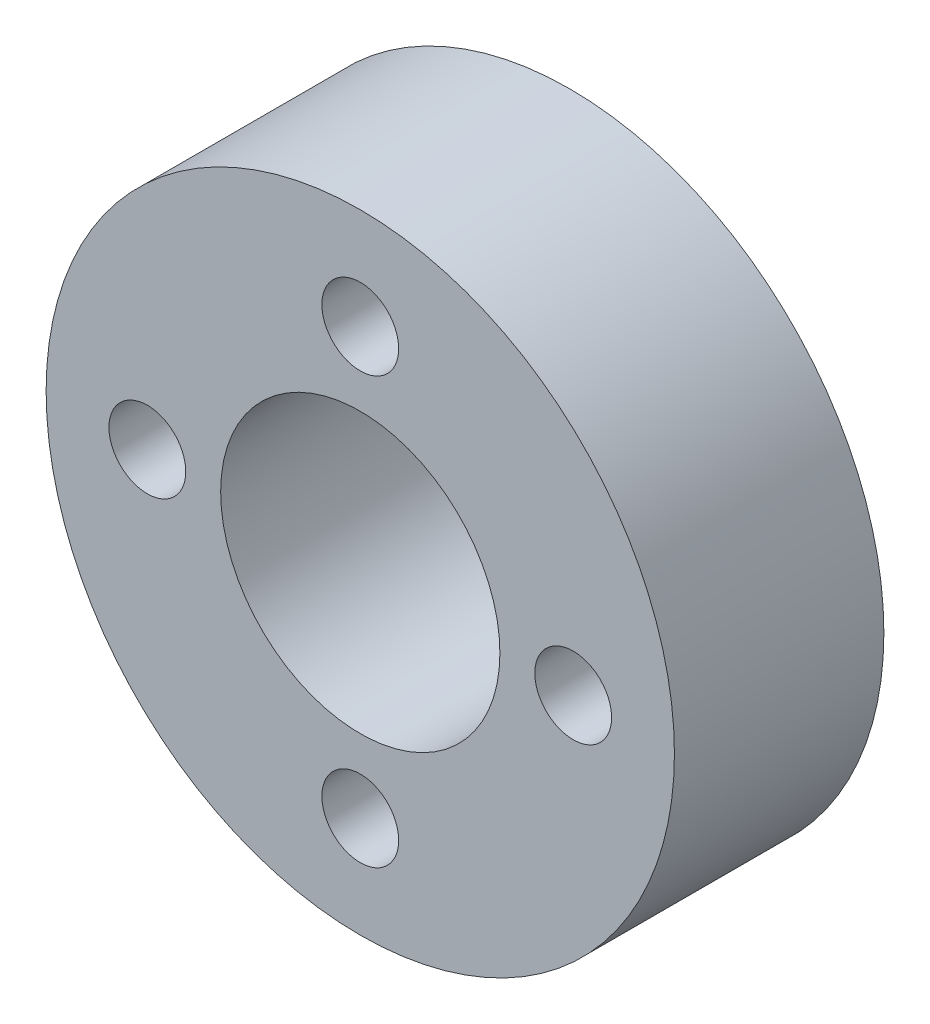
ISO-10303-21;
HEADER;
FILE_DESCRIPTION(('STEP AP214'),'2;1');
FILE_NAME('part.step','',(''),(''),'','','');
FILE_SCHEMA(('AUTOMOTIVE_DESIGN { 1 0 10303 214 1 1 1 1 }'));
ENDSEC;
DATA;
#1=APPLICATION_CONTEXT('core data for automotive mechanical design processes');
#2=APPLICATION_PROTOCOL_DEFINITION('international standard','automotive_design',2000,#1);
#3=PRODUCT_CONTEXT('',#1,'mechanical');
#4=PRODUCT('Part','Part','',(#3));
#5=PRODUCT_RELATED_PRODUCT_CATEGORY('part','',(#4));
#6=PRODUCT_DEFINITION_FORMATION('','',#4);
#7=PRODUCT_DEFINITION_CONTEXT('part definition',#1,'design');
#8=PRODUCT_DEFINITION('design','',#6,#7);
#9=PRODUCT_DEFINITION_SHAPE('','',#8);
#10=(LENGTH_UNIT() NAMED_UNIT(*) SI_UNIT(.MILLI.,.METRE.));
#11=(NAMED_UNIT(*) PLANE_ANGLE_UNIT() SI_UNIT($,.RADIAN.));
#12=(NAMED_UNIT(*) SI_UNIT($,.STERADIAN.) SOLID_ANGLE_UNIT());
#13=UNCERTAINTY_MEASURE_WITH_UNIT(LENGTH_MEASURE(1.E-05),#10,'distance_accuracy_value','');
#14=(GEOMETRIC_REPRESENTATION_CONTEXT(3) GLOBAL_UNCERTAINTY_ASSIGNED_CONTEXT((#13)) GLOBAL_UNIT_ASSIGNED_CONTEXT((#10,
#11,#12)) REPRESENTATION_CONTEXT('',''));
#15=CARTESIAN_POINT('',(0.,0.,0.));
#16=DIRECTION('',(0.,0.,1.));
#17=DIRECTION('',(1.,0.,0.));
#18=AXIS2_PLACEMENT_3D('',#15,#16,#17);
#19=CARTESIAN_POINT('',(0.,0.,-2.));
#20=DIRECTION('',(0.,0.,1.));
#21=DIRECTION('',(1.,0.,0.));
#22=AXIS2_PLACEMENT_3D('',#19,#20,#21);
#23=CYLINDRICAL_SURFACE('',#22,16.);
#24=CARTESIAN_POINT('',(0.,0.,0.));
#25=DIRECTION('',(0.,0.,-1.));
#26=DIRECTION('',(-1.,0.,0.));
#27=AXIS2_PLACEMENT_3D('',#24,#25,#26);
#28=CIRCLE('',#27,16.);
#29=CARTESIAN_POINT('',(-15.7704918032787,2.70029411041083,0.));
#30=VERTEX_POINT('',#29);
#31=CARTESIAN_POINT('',(-2.70029411041087,15.7704918032787,0.));
#32=VERTEX_POINT('',#31);
#33=EDGE_CURVE('E117',#30,#32,#28,.T.);
#34=ORIENTED_EDGE('',*,*,#33,.T.);
#35=DIRECTION('',(0.,0.,-1.));
#36=VECTOR('',#35,1.);
#37=CARTESIAN_POINT('',(-2.70029411041088,15.7704918032787,6.5));
#38=LINE('',#37,#36);
#39=CARTESIAN_POINT('',(-2.70029411041088,15.7704918032787,-2.));
#40=VERTEX_POINT('',#39);
#41=EDGE_CURVE('E180',#32,#40,#38,.T.);
#42=ORIENTED_EDGE('',*,*,#41,.T.);
#43=CARTESIAN_POINT('',(0.,0.,-2.));
#44=DIRECTION('',(0.,0.,-1.));
#45=DIRECTION('',(-1.,0.,0.));
#46=AXIS2_PLACEMENT_3D('',#43,#44,#45);
#47=CIRCLE('',#46,16.);
#48=CARTESIAN_POINT('',(-15.7704918032787,2.70029411041083,-2.));
#49=VERTEX_POINT('',#48);
#50=EDGE_CURVE('E140',#49,#40,#47,.T.);
#51=ORIENTED_EDGE('',*,*,#50,.F.);
#52=DIRECTION('',(0.,0.,-1.));
#53=VECTOR('',#52,1.);
#54=CARTESIAN_POINT('',(-15.7704918032787,2.70029411041083,6.5));
#55=LINE('',#54,#53);
#56=EDGE_CURVE('E127',#49,#30,#55,.F.);
#57=ORIENTED_EDGE('',*,*,#56,.T.);
#58=EDGE_LOOP('',(#34,#42,#51,#57));
#59=FACE_BOUND('',#58,.T.);
#60=ADVANCED_FACE('F45',(#59),#23,.T.);
#61=CARTESIAN_POINT('',(2.70029411041087,15.7704918032787,-2.));
#62=VERTEX_POINT('',#61);
#63=CARTESIAN_POINT('',(15.7704918032787,2.70029411041105,-2.));
#64=VERTEX_POINT('',#63);
#65=EDGE_CURVE('E135',#62,#64,#47,.T.);
#66=ORIENTED_EDGE('',*,*,#65,.F.);
#67=DIRECTION('',(0.,0.,-1.));
#68=VECTOR('',#67,1.);
#69=CARTESIAN_POINT('',(2.70029411041088,15.7704918032787,6.5));
#70=LINE('',#69,#68);
#71=CARTESIAN_POINT('',(2.70029411041088,15.7704918032787,0.));
#72=VERTEX_POINT('',#71);
#73=EDGE_CURVE('E172',#62,#72,#70,.F.);
#74=ORIENTED_EDGE('',*,*,#73,.T.);
#75=CARTESIAN_POINT('',(15.7704918032787,2.70029411041103,0.));
#76=VERTEX_POINT('',#75);
#77=EDGE_CURVE('E152',#72,#76,#28,.T.);
#78=ORIENTED_EDGE('',*,*,#77,.T.);
#79=DIRECTION('',(0.,0.,-1.));
#80=VECTOR('',#79,1.);
#81=CARTESIAN_POINT('',(15.7704918032787,2.70029411041105,6.5));
#82=LINE('',#81,#80);
#83=EDGE_CURVE('E163',#76,#64,#82,.T.);
#84=ORIENTED_EDGE('',*,*,#83,.T.);
#85=EDGE_LOOP('',(#66,#74,#78,#84));
#86=FACE_BOUND('',#85,.T.);
#87=ADVANCED_FACE('F168',(#86),#23,.T.);
#88=CARTESIAN_POINT('',(-2.70029411041076,-15.7704918032787,0.));
#89=VERTEX_POINT('',#88);
#90=CARTESIAN_POINT('',(-15.7704918032787,-2.70029411041094,0.));
#91=VERTEX_POINT('',#90);
#92=EDGE_CURVE('E153',#89,#91,#28,.T.);
#93=ORIENTED_EDGE('',*,*,#92,.T.);
#94=DIRECTION('',(0.,0.,-1.));
#95=VECTOR('',#94,1.);
#96=CARTESIAN_POINT('',(-15.7704918032787,-2.70029411041094,6.5));
#97=LINE('',#96,#95);
#98=CARTESIAN_POINT('',(-15.7704918032787,-2.70029411041094,-2.));
#99=VERTEX_POINT('',#98);
#100=EDGE_CURVE('E240',#91,#99,#97,.T.);
#101=ORIENTED_EDGE('',*,*,#100,.T.);
#102=CARTESIAN_POINT('',(-2.70029411041076,-15.7704918032787,-2.));
#103=VERTEX_POINT('',#102);
#104=EDGE_CURVE('E136',#103,#99,#47,.T.);
#105=ORIENTED_EDGE('',*,*,#104,.F.);
#106=DIRECTION('',(0.,0.,-1.));
#107=VECTOR('',#106,1.);
#108=CARTESIAN_POINT('',(-2.70029411041077,-15.7704918032787,6.5));
#109=LINE('',#108,#107);
#110=EDGE_CURVE('E61',#103,#89,#109,.F.);
#111=ORIENTED_EDGE('',*,*,#110,.T.);
#112=EDGE_LOOP('',(#93,#101,#105,#111));
#113=FACE_BOUND('',#112,.T.);
#114=ADVANCED_FACE('F213',(#113),#23,.T.);
#115=CARTESIAN_POINT('',(0.,0.,15.));
#116=DIRECTION('',(0.,0.,-1.));
#117=DIRECTION('',(-1.,0.,0.));
#118=AXIS2_PLACEMENT_3D('',#115,#116,#117);
#119=CYLINDRICAL_SURFACE('',#118,22.5);
#120=CARTESIAN_POINT('',(0.,0.,15.));
#121=DIRECTION('',(0.,0.,1.));
#122=DIRECTION('',(1.,0.,0.));
#123=AXIS2_PLACEMENT_3D('',#120,#121,#122);
#124=CIRCLE('',#123,22.5);
#125=CARTESIAN_POINT('',(22.5,0.,15.));
#126=VERTEX_POINT('',#125);
#127=EDGE_CURVE('E154',#126,#126,#124,.T.);
#128=ORIENTED_EDGE('',*,*,#127,.F.);
#129=EDGE_LOOP('',(#128));
#130=FACE_BOUND('',#129,.T.);
#131=CARTESIAN_POINT('',(0.,0.,0.));
#132=DIRECTION('',(0.,0.,1.));
#133=DIRECTION('',(1.,0.,0.));
#134=AXIS2_PLACEMENT_3D('',#131,#132,#133);
#135=CIRCLE('',#134,22.5);
#136=CARTESIAN_POINT('',(22.5,0.,0.));
#137=VERTEX_POINT('',#136);
#138=EDGE_CURVE('E146',#137,#137,#135,.T.);
#139=ORIENTED_EDGE('',*,*,#138,.T.);
#140=EDGE_LOOP('',(#139));
#141=FACE_BOUND('',#140,.T.);
#142=ADVANCED_FACE('F47',(#130,#141),#119,.T.);
#143=CARTESIAN_POINT('',(0.,0.,15.));
#144=DIRECTION('',(0.,0.,1.));
#145=DIRECTION('',(1.,0.,0.));
#146=AXIS2_PLACEMENT_3D('',#143,#144,#145);
#147=PLANE('',#146);
#148=CARTESIAN_POINT('',(0.,15.25,15.));
#149=DIRECTION('',(0.,0.,-1.));
#150=DIRECTION('',(-1.,0.,0.));
#151=AXIS2_PLACEMENT_3D('',#148,#149,#150);
#152=CIRCLE('',#151,2.75);
#153=CARTESIAN_POINT('',(-2.75,15.25,15.));
#154=VERTEX_POINT('',#153);
#155=EDGE_CURVE('E263',#154,#154,#152,.T.);
#156=ORIENTED_EDGE('',*,*,#155,.T.);
#157=EDGE_LOOP('',(#156));
#158=FACE_BOUND('',#157,.T.);
#159=CARTESIAN_POINT('',(15.25,1.59735271252073E-13,15.));
#160=DIRECTION('',(0.,0.,-1.));
#161=DIRECTION('',(-1.,0.,0.));
#162=AXIS2_PLACEMENT_3D('',#159,#160,#161);
#163=CIRCLE('',#162,2.75);
#164=CARTESIAN_POINT('',(12.5,1.59735271252073E-13,15.));
#165=VERTEX_POINT('',#164);
#166=EDGE_CURVE('E275',#165,#165,#163,.T.);
#167=ORIENTED_EDGE('',*,*,#166,.T.);
#168=EDGE_LOOP('',(#167));
#169=FACE_BOUND('',#168,.T.);
#170=CARTESIAN_POINT('',(-15.25,0.,15.));
#171=DIRECTION('',(0.,0.,-1.));
#172=DIRECTION('',(-1.,0.,0.));
#173=AXIS2_PLACEMENT_3D('',#170,#171,#172);
#174=CIRCLE('',#173,2.75);
#175=CARTESIAN_POINT('',(-18.,0.,15.));
#176=VERTEX_POINT('',#175);
#177=EDGE_CURVE('E268',#176,#176,#174,.T.);
#178=ORIENTED_EDGE('',*,*,#177,.T.);
#179=EDGE_LOOP('',(#178));
#180=FACE_BOUND('',#179,.T.);
#181=CARTESIAN_POINT('',(1.06490180834716E-13,-15.25,15.));
#182=DIRECTION('',(0.,0.,-1.));
#183=DIRECTION('',(-1.,0.,0.));
#184=AXIS2_PLACEMENT_3D('',#181,#182,#183);
#185=CIRCLE('',#184,2.75);
#186=CARTESIAN_POINT('',(-2.74999999999989,-15.25,15.));
#187=VERTEX_POINT('',#186);
#188=EDGE_CURVE('E264',#187,#187,#185,.T.);
#189=ORIENTED_EDGE('',*,*,#188,.T.);
#190=EDGE_LOOP('',(#189));
#191=FACE_BOUND('',#190,.T.);
#192=CARTESIAN_POINT('',(0.,0.,15.));
#193=DIRECTION('',(0.,0.,-1.));
#194=DIRECTION('',(-1.,0.,0.));
#195=AXIS2_PLACEMENT_3D('',#192,#193,#194);
#196=CIRCLE('',#195,10.);
#197=CARTESIAN_POINT('',(-10.,0.,15.));
#198=VERTEX_POINT('',#197);
#199=EDGE_CURVE('E141',#198,#198,#196,.T.);
#200=ORIENTED_EDGE('',*,*,#199,.T.);
#201=EDGE_LOOP('',(#200));
#202=FACE_BOUND('',#201,.T.);
#203=ORIENTED_EDGE('',*,*,#127,.T.);
#204=EDGE_LOOP('',(#203));
#205=FACE_BOUND('',#204,.T.);
#206=ADVANCED_FACE('F197',(#158,#169,#180,#191,#202,#205),#147,.T.);
#207=CARTESIAN_POINT('',(0.,0.,0.));
#208=DIRECTION('',(0.,0.,1.));
#209=DIRECTION('',(1.,0.,0.));
#210=AXIS2_PLACEMENT_3D('',#207,#208,#209);
#211=PLANE('',#210);
#212=ORIENTED_EDGE('',*,*,#77,.F.);
#213=CARTESIAN_POINT('',(0.,15.25,0.));
#214=DIRECTION('',(0.,0.,1.));
#215=DIRECTION('',(1.,0.,0.));
#216=AXIS2_PLACEMENT_3D('',#213,#214,#215);
#217=CIRCLE('',#216,2.75);
#218=EDGE_CURVE('E186',#72,#32,#217,.T.);
#219=ORIENTED_EDGE('',*,*,#218,.T.);
#220=ORIENTED_EDGE('',*,*,#33,.F.);
#221=CARTESIAN_POINT('',(-15.25,0.,0.));
#222=DIRECTION('',(0.,0.,1.));
#223=DIRECTION('',(1.,0.,0.));
#224=AXIS2_PLACEMENT_3D('',#221,#222,#223);
#225=CIRCLE('',#224,2.75);
#226=EDGE_CURVE('E245',#30,#91,#225,.T.);
#227=ORIENTED_EDGE('',*,*,#226,.T.);
#228=ORIENTED_EDGE('',*,*,#92,.F.);
#229=CARTESIAN_POINT('',(1.06490180834716E-13,-15.25,0.));
#230=DIRECTION('',(0.,0.,1.));
#231=DIRECTION('',(1.,0.,0.));
#232=AXIS2_PLACEMENT_3D('',#229,#230,#231);
#233=CIRCLE('',#232,2.75);
#234=CARTESIAN_POINT('',(2.70029411041098,-15.7704918032787,0.));
#235=VERTEX_POINT('',#234);
#236=EDGE_CURVE('E128',#89,#235,#233,.T.);
#237=ORIENTED_EDGE('',*,*,#236,.T.);
#238=CARTESIAN_POINT('',(15.7704918032787,-2.70029411041072,0.));
#239=VERTEX_POINT('',#238);
#240=EDGE_CURVE('E125',#239,#235,#28,.T.);
#241=ORIENTED_EDGE('',*,*,#240,.F.);
#242=CARTESIAN_POINT('',(15.25,1.59735271252073E-13,0.));
#243=DIRECTION('',(0.,0.,1.));
#244=DIRECTION('',(1.,0.,0.));
#245=AXIS2_PLACEMENT_3D('',#242,#243,#244);
#246=CIRCLE('',#245,2.75);
#247=EDGE_CURVE('E173',#239,#76,#246,.T.);
#248=ORIENTED_EDGE('',*,*,#247,.T.);
#249=EDGE_LOOP('',(#212,#219,#220,#227,#228,#237,#241,#248));
#250=FACE_BOUND('',#249,.T.);
#251=ORIENTED_EDGE('',*,*,#138,.F.);
#252=EDGE_LOOP('',(#251));
#253=FACE_BOUND('',#252,.T.);
#254=ADVANCED_FACE('F211',(#250,#253),#211,.F.);
#255=CARTESIAN_POINT('',(15.7704918032787,-2.7002941104107,-2.));
#256=VERTEX_POINT('',#255);
#257=CARTESIAN_POINT('',(2.70029411041099,-15.7704918032787,-2.));
#258=VERTEX_POINT('',#257);
#259=EDGE_CURVE('E123',#256,#258,#47,.T.);
#260=ORIENTED_EDGE('',*,*,#259,.F.);
#261=DIRECTION('',(0.,0.,-1.));
#262=VECTOR('',#261,1.);
#263=CARTESIAN_POINT('',(15.7704918032787,-2.70029411041072,6.5));
#264=LINE('',#263,#262);
#265=EDGE_CURVE('E69',#256,#239,#264,.F.);
#266=ORIENTED_EDGE('',*,*,#265,.T.);
#267=ORIENTED_EDGE('',*,*,#240,.T.);
#268=DIRECTION('',(0.,0.,-1.));
#269=VECTOR('',#268,1.);
#270=CARTESIAN_POINT('',(2.70029411041099,-15.7704918032787,6.5));
#271=LINE('',#270,#269);
#272=EDGE_CURVE('E110',#235,#258,#271,.T.);
#273=ORIENTED_EDGE('',*,*,#272,.T.);
#274=EDGE_LOOP('',(#260,#266,#267,#273));
#275=FACE_BOUND('',#274,.T.);
#276=ADVANCED_FACE('F122',(#275),#23,.T.);
#277=CARTESIAN_POINT('',(0.,0.,-2.));
#278=DIRECTION('',(0.,0.,-1.));
#279=DIRECTION('',(-1.,0.,0.));
#280=AXIS2_PLACEMENT_3D('',#277,#278,#279);
#281=PLANE('',#280);
#282=CARTESIAN_POINT('',(0.,15.25,-2.));
#283=DIRECTION('',(0.,0.,-1.));
#284=DIRECTION('',(-1.,0.,0.));
#285=AXIS2_PLACEMENT_3D('',#282,#283,#284);
#286=CIRCLE('',#285,2.75);
#287=EDGE_CURVE('E11',#62,#40,#286,.T.);
#288=ORIENTED_EDGE('',*,*,#287,.F.);
#289=ORIENTED_EDGE('',*,*,#65,.T.);
#290=CARTESIAN_POINT('',(15.25,1.59735271252073E-13,-2.));
#291=DIRECTION('',(0.,0.,-1.));
#292=DIRECTION('',(-1.,0.,0.));
#293=AXIS2_PLACEMENT_3D('',#290,#291,#292);
#294=CIRCLE('',#293,2.75);
#295=EDGE_CURVE('E54',#256,#64,#294,.T.);
#296=ORIENTED_EDGE('',*,*,#295,.F.);
#297=ORIENTED_EDGE('',*,*,#259,.T.);
#298=CARTESIAN_POINT('',(1.06490180834716E-13,-15.25,-2.));
#299=DIRECTION('',(0.,0.,-1.));
#300=DIRECTION('',(-1.,0.,0.));
#301=AXIS2_PLACEMENT_3D('',#298,#299,#300);
#302=CIRCLE('',#301,2.75);
#303=EDGE_CURVE('E107',#103,#258,#302,.T.);
#304=ORIENTED_EDGE('',*,*,#303,.F.);
#305=ORIENTED_EDGE('',*,*,#104,.T.);
#306=CARTESIAN_POINT('',(-15.25,0.,-2.));
#307=DIRECTION('',(0.,0.,-1.));
#308=DIRECTION('',(-1.,0.,0.));
#309=AXIS2_PLACEMENT_3D('',#306,#307,#308);
#310=CIRCLE('',#309,2.75);
#311=EDGE_CURVE('E272',#49,#99,#310,.T.);
#312=ORIENTED_EDGE('',*,*,#311,.F.);
#313=ORIENTED_EDGE('',*,*,#50,.T.);
#314=EDGE_LOOP('',(#288,#289,#296,#297,#304,#305,#312,#313));
#315=FACE_BOUND('',#314,.T.);
#316=CARTESIAN_POINT('',(0.,0.,-2.));
#317=DIRECTION('',(0.,0.,-1.));
#318=DIRECTION('',(-1.,0.,0.));
#319=AXIS2_PLACEMENT_3D('',#316,#317,#318);
#320=CIRCLE('',#319,10.);
#321=CARTESIAN_POINT('',(-10.,0.,-2.));
#322=VERTEX_POINT('',#321);
#323=EDGE_CURVE('E147',#322,#322,#320,.T.);
#324=ORIENTED_EDGE('',*,*,#323,.F.);
#325=EDGE_LOOP('',(#324));
#326=FACE_BOUND('',#325,.T.);
#327=ADVANCED_FACE('F131',(#315,#326),#281,.T.);
#328=CARTESIAN_POINT('',(0.,0.,15.));
#329=DIRECTION('',(0.,0.,-1.));
#330=DIRECTION('',(-1.,0.,0.));
#331=AXIS2_PLACEMENT_3D('',#328,#329,#330);
#332=CYLINDRICAL_SURFACE('',#331,10.);
#333=ORIENTED_EDGE('',*,*,#199,.F.);
#334=EDGE_LOOP('',(#333));
#335=FACE_BOUND('',#334,.T.);
#336=ORIENTED_EDGE('',*,*,#323,.T.);
#337=EDGE_LOOP('',(#336));
#338=FACE_BOUND('',#337,.T.);
#339=ADVANCED_FACE('F200',(#335,#338),#332,.F.);
#340=CARTESIAN_POINT('',(1.06490180834716E-13,-15.25,15.));
#341=DIRECTION('',(0.,0.,-1.));
#342=DIRECTION('',(-1.,0.,0.));
#343=AXIS2_PLACEMENT_3D('',#340,#341,#342);
#344=CYLINDRICAL_SURFACE('',#343,2.75);
#345=ORIENTED_EDGE('',*,*,#188,.F.);
#346=EDGE_LOOP('',(#345));
#347=FACE_BOUND('',#346,.T.);
#348=ORIENTED_EDGE('',*,*,#236,.F.);
#349=ORIENTED_EDGE('',*,*,#110,.F.);
#350=ORIENTED_EDGE('',*,*,#303,.T.);
#351=ORIENTED_EDGE('',*,*,#272,.F.);
#352=EDGE_LOOP('',(#348,#349,#350,#351));
#353=FACE_BOUND('',#352,.T.);
#354=ADVANCED_FACE('F109',(#347,#353),#344,.F.);
#355=CARTESIAN_POINT('',(-15.25,0.,15.));
#356=DIRECTION('',(0.,0.,-1.));
#357=DIRECTION('',(-1.,0.,0.));
#358=AXIS2_PLACEMENT_3D('',#355,#356,#357);
#359=CYLINDRICAL_SURFACE('',#358,2.75);
#360=ORIENTED_EDGE('',*,*,#177,.F.);
#361=EDGE_LOOP('',(#360));
#362=FACE_BOUND('',#361,.T.);
#363=ORIENTED_EDGE('',*,*,#226,.F.);
#364=ORIENTED_EDGE('',*,*,#56,.F.);
#365=ORIENTED_EDGE('',*,*,#311,.T.);
#366=ORIENTED_EDGE('',*,*,#100,.F.);
#367=EDGE_LOOP('',(#363,#364,#365,#366));
#368=FACE_BOUND('',#367,.T.);
#369=ADVANCED_FACE('F289',(#362,#368),#359,.F.);
#370=CARTESIAN_POINT('',(15.25,1.59735271252073E-13,15.));
#371=DIRECTION('',(0.,0.,-1.));
#372=DIRECTION('',(-1.,0.,0.));
#373=AXIS2_PLACEMENT_3D('',#370,#371,#372);
#374=CYLINDRICAL_SURFACE('',#373,2.75);
#375=ORIENTED_EDGE('',*,*,#166,.F.);
#376=EDGE_LOOP('',(#375));
#377=FACE_BOUND('',#376,.T.);
#378=ORIENTED_EDGE('',*,*,#247,.F.);
#379=ORIENTED_EDGE('',*,*,#265,.F.);
#380=ORIENTED_EDGE('',*,*,#295,.T.);
#381=ORIENTED_EDGE('',*,*,#83,.F.);
#382=EDGE_LOOP('',(#378,#379,#380,#381));
#383=FACE_BOUND('',#382,.T.);
#384=ADVANCED_FACE('F162',(#377,#383),#374,.F.);
#385=CARTESIAN_POINT('',(0.,15.25,15.));
#386=DIRECTION('',(0.,0.,-1.));
#387=DIRECTION('',(-1.,0.,0.));
#388=AXIS2_PLACEMENT_3D('',#385,#386,#387);
#389=CYLINDRICAL_SURFACE('',#388,2.75);
#390=ORIENTED_EDGE('',*,*,#155,.F.);
#391=EDGE_LOOP('',(#390));
#392=FACE_BOUND('',#391,.T.);
#393=ORIENTED_EDGE('',*,*,#218,.F.);
#394=ORIENTED_EDGE('',*,*,#73,.F.);
#395=ORIENTED_EDGE('',*,*,#287,.T.);
#396=ORIENTED_EDGE('',*,*,#41,.F.);
#397=EDGE_LOOP('',(#393,#394,#395,#396));
#398=FACE_BOUND('',#397,.T.);
#399=ADVANCED_FACE('F179',(#392,#398),#389,.F.);
#400=CLOSED_SHELL('',(#60,#87,#114,#142,#206,#254,#276,#327,#339,#354,#369,#384,#399));
#401=MANIFOLD_SOLID_BREP('B2',#400);
#402=ADVANCED_BREP_SHAPE_REPRESENTATION('',(#18,#401),#14);
#403=SHAPE_DEFINITION_REPRESENTATION(#9,#402);
ENDSEC;
END-ISO-10303-21;
